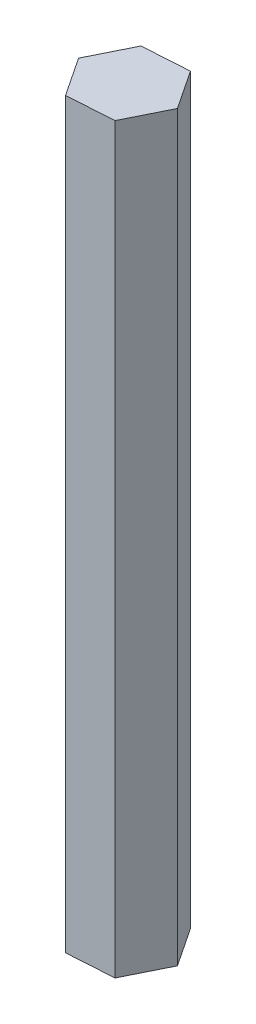
ISO-10303-21;
HEADER;
FILE_DESCRIPTION(('STEP AP214'),'2;1');
FILE_NAME('part.step','',(''),(''),'','','');
FILE_SCHEMA(('AUTOMOTIVE_DESIGN { 1 0 10303 214 1 1 1 1 }'));
ENDSEC;
DATA;
#1=APPLICATION_CONTEXT('core data for automotive mechanical design processes');
#2=APPLICATION_PROTOCOL_DEFINITION('international standard','automotive_design',2000,#1);
#3=PRODUCT_CONTEXT('',#1,'mechanical');
#4=PRODUCT('Part','Part','',(#3));
#5=PRODUCT_RELATED_PRODUCT_CATEGORY('part','',(#4));
#6=PRODUCT_DEFINITION_FORMATION('','',#4);
#7=PRODUCT_DEFINITION_CONTEXT('part definition',#1,'design');
#8=PRODUCT_DEFINITION('design','',#6,#7);
#9=PRODUCT_DEFINITION_SHAPE('','',#8);
#10=(LENGTH_UNIT() NAMED_UNIT(*) SI_UNIT(.MILLI.,.METRE.));
#11=(NAMED_UNIT(*) PLANE_ANGLE_UNIT() SI_UNIT($,.RADIAN.));
#12=(NAMED_UNIT(*) SI_UNIT($,.STERADIAN.) SOLID_ANGLE_UNIT());
#13=UNCERTAINTY_MEASURE_WITH_UNIT(LENGTH_MEASURE(1.E-05),#10,'distance_accuracy_value','');
#14=(GEOMETRIC_REPRESENTATION_CONTEXT(3) GLOBAL_UNCERTAINTY_ASSIGNED_CONTEXT((#13)) GLOBAL_UNIT_ASSIGNED_CONTEXT((#10,
#11,#12)) REPRESENTATION_CONTEXT('',''));
#15=CARTESIAN_POINT('',(0.,0.,0.));
#16=DIRECTION('',(0.,0.,1.));
#17=DIRECTION('',(1.,0.,0.));
#18=AXIS2_PLACEMENT_3D('',#15,#16,#17);
#19=CARTESIAN_POINT('',(7.31785977013899,116.84,-0.460718697162052));
#20=DIRECTION('',(-0.832897288147061,0.,0.553427599056346));
#21=DIRECTION('',(0.553427599056346,0.,0.832897288147061));
#22=AXIS2_PLACEMENT_3D('',#19,#20,#21);
#23=PLANE('',#22);
#24=DIRECTION('',(-0.553427599056346,0.,-0.832897288147061));
#25=VECTOR('',#24,1.);
#26=CARTESIAN_POINT('',(7.31785977013899,0.,-0.460718697162052));
#27=LINE('',#26,#25);
#28=CARTESIAN_POINT('',(7.31785977013899,0.,-0.460718697162052));
#29=VERTEX_POINT('',#28);
#30=CARTESIAN_POINT('',(3.25993578932869,0.,-6.56781181085354));
#31=VERTEX_POINT('',#30);
#32=EDGE_CURVE('E121',#29,#31,#27,.T.);
#33=ORIENTED_EDGE('',*,*,#32,.T.);
#34=DIRECTION('',(0.,-1.,0.));
#35=VECTOR('',#34,1.);
#36=CARTESIAN_POINT('',(3.25993578932869,116.84,-6.56781181085354));
#37=LINE('',#36,#35);
#38=CARTESIAN_POINT('',(3.25993578932869,116.84,-6.56781181085354));
#39=VERTEX_POINT('',#38);
#40=EDGE_CURVE('E11',#39,#31,#37,.T.);
#41=ORIENTED_EDGE('',*,*,#40,.F.);
#42=DIRECTION('',(-0.553427599056346,0.,-0.832897288147061));
#43=VECTOR('',#42,1.);
#44=CARTESIAN_POINT('',(7.31785977013899,116.84,-0.460718697162052));
#45=LINE('',#44,#43);
#46=CARTESIAN_POINT('',(7.31785977013899,116.84,-0.460718697162052));
#47=VERTEX_POINT('',#46);
#48=EDGE_CURVE('E131',#47,#39,#45,.T.);
#49=ORIENTED_EDGE('',*,*,#48,.F.);
#50=DIRECTION('',(0.,-1.,0.));
#51=VECTOR('',#50,1.);
#52=CARTESIAN_POINT('',(7.31785977013899,116.84,-0.460718697162052));
#53=LINE('',#52,#51);
#54=EDGE_CURVE('E117',#47,#29,#53,.T.);
#55=ORIENTED_EDGE('',*,*,#54,.T.);
#56=EDGE_LOOP('',(#33,#41,#49,#55));
#57=FACE_BOUND('',#56,.T.);
#58=ADVANCED_FACE('F37',(#57),#23,.F.);
#59=CARTESIAN_POINT('',(3.25993578932869,116.84,-6.56781181085354));
#60=DIRECTION('',(0.0628337158646939,0.,0.998024009806695));
#61=DIRECTION('',(0.998024009806696,0.,-0.062833715864694));
#62=AXIS2_PLACEMENT_3D('',#59,#60,#61);
#63=PLANE('',#62);
#64=DIRECTION('',(-0.998024009806695,0.,0.0628337158646939));
#65=VECTOR('',#64,1.);
#66=CARTESIAN_POINT('',(3.25993578932869,0.,-6.56781181085354));
#67=LINE('',#66,#65);
#68=CARTESIAN_POINT('',(-4.0579239808103,0.,-6.10709311369149));
#69=VERTEX_POINT('',#68);
#70=EDGE_CURVE('E124',#31,#69,#67,.T.);
#71=ORIENTED_EDGE('',*,*,#70,.T.);
#72=DIRECTION('',(0.,-1.,0.));
#73=VECTOR('',#72,1.);
#74=CARTESIAN_POINT('',(-4.0579239808103,116.84,-6.10709311369149));
#75=LINE('',#74,#73);
#76=CARTESIAN_POINT('',(-4.0579239808103,116.84,-6.10709311369149));
#77=VERTEX_POINT('',#76);
#78=EDGE_CURVE('E45',#77,#69,#75,.T.);
#79=ORIENTED_EDGE('',*,*,#78,.F.);
#80=DIRECTION('',(-0.998024009806695,0.,0.0628337158646939));
#81=VECTOR('',#80,1.);
#82=CARTESIAN_POINT('',(3.25993578932869,116.84,-6.56781181085354));
#83=LINE('',#82,#81);
#84=EDGE_CURVE('E90',#39,#77,#83,.T.);
#85=ORIENTED_EDGE('',*,*,#84,.F.);
#86=ORIENTED_EDGE('',*,*,#40,.T.);
#87=EDGE_LOOP('',(#71,#79,#85,#86));
#88=FACE_BOUND('',#87,.T.);
#89=ADVANCED_FACE('F155',(#88),#63,.F.);
#90=CARTESIAN_POINT('',(-4.0579239808103,116.84,-6.10709311369149));
#91=DIRECTION('',(0.895731004011755,0.,0.444596410750349));
#92=DIRECTION('',(0.444596410750349,0.,-0.895731004011755));
#93=AXIS2_PLACEMENT_3D('',#90,#91,#92);
#94=PLANE('',#93);
#95=DIRECTION('',(-0.444596410750349,0.,0.895731004011755));
#96=VECTOR('',#95,1.);
#97=CARTESIAN_POINT('',(-4.0579239808103,0.,-6.10709311369149));
#98=LINE('',#97,#96);
#99=CARTESIAN_POINT('',(-7.31785977013899,0.,0.460718697162054));
#100=VERTEX_POINT('',#99);
#101=EDGE_CURVE('E126',#69,#100,#98,.T.);
#102=ORIENTED_EDGE('',*,*,#101,.T.);
#103=DIRECTION('',(0.,-1.,0.));
#104=VECTOR('',#103,1.);
#105=CARTESIAN_POINT('',(-7.31785977013899,116.84,0.460718697162054));
#106=LINE('',#105,#104);
#107=CARTESIAN_POINT('',(-7.31785977013899,116.84,0.460718697162054));
#108=VERTEX_POINT('',#107);
#109=EDGE_CURVE('E112',#108,#100,#106,.T.);
#110=ORIENTED_EDGE('',*,*,#109,.F.);
#111=DIRECTION('',(-0.444596410750349,0.,0.895731004011755));
#112=VECTOR('',#111,1.);
#113=CARTESIAN_POINT('',(-4.0579239808103,116.84,-6.10709311369149));
#114=LINE('',#113,#112);
#115=EDGE_CURVE('E103',#77,#108,#114,.T.);
#116=ORIENTED_EDGE('',*,*,#115,.F.);
#117=ORIENTED_EDGE('',*,*,#78,.T.);
#118=EDGE_LOOP('',(#102,#110,#116,#117));
#119=FACE_BOUND('',#118,.T.);
#120=ADVANCED_FACE('F137',(#119),#94,.F.);
#121=CARTESIAN_POINT('',(-7.31785977013899,116.84,0.460718697162054));
#122=DIRECTION('',(0.832897288147061,0.,-0.553427599056346));
#123=DIRECTION('',(-0.553427599056346,0.,-0.832897288147061));
#124=AXIS2_PLACEMENT_3D('',#121,#122,#123);
#125=PLANE('',#124);
#126=DIRECTION('',(0.553427599056346,0.,0.832897288147061));
#127=VECTOR('',#126,1.);
#128=CARTESIAN_POINT('',(-7.31785977013899,0.,0.460718697162054));
#129=LINE('',#128,#127);
#130=CARTESIAN_POINT('',(-3.25993578932868,0.,6.56781181085354));
#131=VERTEX_POINT('',#130);
#132=EDGE_CURVE('E111',#100,#131,#129,.T.);
#133=ORIENTED_EDGE('',*,*,#132,.T.);
#134=DIRECTION('',(0.,-1.,0.));
#135=VECTOR('',#134,1.);
#136=CARTESIAN_POINT('',(-3.25993578932868,116.84,6.56781181085354));
#137=LINE('',#136,#135);
#138=CARTESIAN_POINT('',(-3.25993578932868,116.84,6.56781181085354));
#139=VERTEX_POINT('',#138);
#140=EDGE_CURVE('E108',#139,#131,#137,.T.);
#141=ORIENTED_EDGE('',*,*,#140,.F.);
#142=DIRECTION('',(0.553427599056346,0.,0.832897288147061));
#143=VECTOR('',#142,1.);
#144=CARTESIAN_POINT('',(-7.31785977013899,116.84,0.460718697162054));
#145=LINE('',#144,#143);
#146=EDGE_CURVE('E97',#108,#139,#145,.T.);
#147=ORIENTED_EDGE('',*,*,#146,.F.);
#148=ORIENTED_EDGE('',*,*,#109,.T.);
#149=EDGE_LOOP('',(#133,#141,#147,#148));
#150=FACE_BOUND('',#149,.T.);
#151=ADVANCED_FACE('F109',(#150),#125,.F.);
#152=CARTESIAN_POINT('',(-3.25993578932868,116.84,6.56781181085354));
#153=DIRECTION('',(-0.0628337158646941,0.,-0.998024009806695));
#154=DIRECTION('',(-0.998024009806695,0.,0.0628337158646941));
#155=AXIS2_PLACEMENT_3D('',#152,#153,#154);
#156=PLANE('',#155);
#157=DIRECTION('',(0.998024009806695,0.,-0.062833715864694));
#158=VECTOR('',#157,1.);
#159=CARTESIAN_POINT('',(-3.25993578932868,0.,6.56781181085354));
#160=LINE('',#159,#158);
#161=CARTESIAN_POINT('',(4.0579239808103,0.,6.10709311369149));
#162=VERTEX_POINT('',#161);
#163=EDGE_CURVE('E76',#131,#162,#160,.T.);
#164=ORIENTED_EDGE('',*,*,#163,.T.);
#165=DIRECTION('',(0.,-1.,0.));
#166=VECTOR('',#165,1.);
#167=CARTESIAN_POINT('',(4.0579239808103,116.84,6.10709311369149));
#168=LINE('',#167,#166);
#169=CARTESIAN_POINT('',(4.0579239808103,116.84,6.10709311369149));
#170=VERTEX_POINT('',#169);
#171=EDGE_CURVE('E113',#170,#162,#168,.T.);
#172=ORIENTED_EDGE('',*,*,#171,.F.);
#173=DIRECTION('',(0.998024009806695,0.,-0.062833715864694));
#174=VECTOR('',#173,1.);
#175=CARTESIAN_POINT('',(-3.25993578932868,116.84,6.56781181085354));
#176=LINE('',#175,#174);
#177=EDGE_CURVE('E101',#139,#170,#176,.T.);
#178=ORIENTED_EDGE('',*,*,#177,.F.);
#179=ORIENTED_EDGE('',*,*,#140,.T.);
#180=EDGE_LOOP('',(#164,#172,#178,#179));
#181=FACE_BOUND('',#180,.T.);
#182=ADVANCED_FACE('F115',(#181),#156,.F.);
#183=CARTESIAN_POINT('',(4.0579239808103,116.84,6.10709311369149));
#184=DIRECTION('',(-0.895731004011755,0.,-0.444596410750349));
#185=DIRECTION('',(-0.444596410750349,0.,0.895731004011755));
#186=AXIS2_PLACEMENT_3D('',#183,#184,#185);
#187=PLANE('',#186);
#188=DIRECTION('',(0.444596410750349,0.,-0.895731004011755));
#189=VECTOR('',#188,1.);
#190=CARTESIAN_POINT('',(4.0579239808103,0.,6.10709311369149));
#191=LINE('',#190,#189);
#192=EDGE_CURVE('E82',#162,#29,#191,.T.);
#193=ORIENTED_EDGE('',*,*,#192,.T.);
#194=ORIENTED_EDGE('',*,*,#54,.F.);
#195=DIRECTION('',(0.444596410750349,0.,-0.895731004011755));
#196=VECTOR('',#195,1.);
#197=CARTESIAN_POINT('',(4.0579239808103,116.84,6.10709311369149));
#198=LINE('',#197,#196);
#199=EDGE_CURVE('E53',#170,#47,#198,.T.);
#200=ORIENTED_EDGE('',*,*,#199,.F.);
#201=ORIENTED_EDGE('',*,*,#171,.T.);
#202=EDGE_LOOP('',(#193,#194,#200,#201));
#203=FACE_BOUND('',#202,.T.);
#204=ADVANCED_FACE('F144',(#203),#187,.F.);
#205=CARTESIAN_POINT('',(0.,116.84,0.));
#206=DIRECTION('',(0.,1.,0.));
#207=DIRECTION('',(0.,0.,1.));
#208=AXIS2_PLACEMENT_3D('',#205,#206,#207);
#209=PLANE('',#208);
#210=ORIENTED_EDGE('',*,*,#48,.T.);
#211=ORIENTED_EDGE('',*,*,#84,.T.);
#212=ORIENTED_EDGE('',*,*,#115,.T.);
#213=ORIENTED_EDGE('',*,*,#146,.T.);
#214=ORIENTED_EDGE('',*,*,#177,.T.);
#215=ORIENTED_EDGE('',*,*,#199,.T.);
#216=EDGE_LOOP('',(#210,#211,#212,#213,#214,#215));
#217=FACE_BOUND('',#216,.T.);
#218=ADVANCED_FACE('F99',(#217),#209,.T.);
#219=CARTESIAN_POINT('',(0.,0.,0.));
#220=DIRECTION('',(0.,1.,0.));
#221=DIRECTION('',(0.,0.,1.));
#222=AXIS2_PLACEMENT_3D('',#219,#220,#221);
#223=PLANE('',#222);
#224=ORIENTED_EDGE('',*,*,#32,.F.);
#225=ORIENTED_EDGE('',*,*,#192,.F.);
#226=ORIENTED_EDGE('',*,*,#163,.F.);
#227=ORIENTED_EDGE('',*,*,#132,.F.);
#228=ORIENTED_EDGE('',*,*,#101,.F.);
#229=ORIENTED_EDGE('',*,*,#70,.F.);
#230=EDGE_LOOP('',(#224,#225,#226,#227,#228,#229));
#231=FACE_BOUND('',#230,.T.);
#232=ADVANCED_FACE('F140',(#231),#223,.F.);
#233=CLOSED_SHELL('',(#58,#89,#120,#151,#182,#204,#218,#232));
#234=MANIFOLD_SOLID_BREP('B2',#233);
#235=ADVANCED_BREP_SHAPE_REPRESENTATION('',(#18,#234),#14);
#236=SHAPE_DEFINITION_REPRESENTATION(#9,#235);
ENDSEC;
END-ISO-10303-21;
